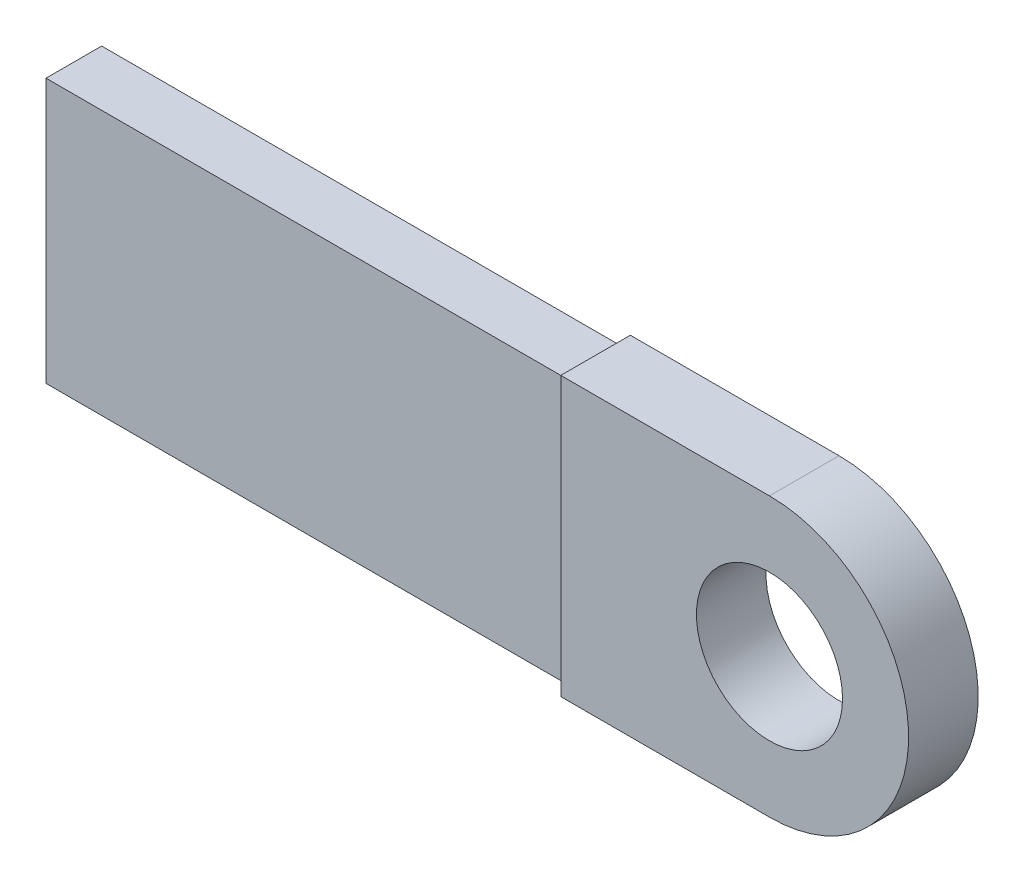
ISO-10303-21;
HEADER;
FILE_DESCRIPTION(('STEP AP214'),'2;1');
FILE_NAME('part.step','',(''),(''),'','','');
FILE_SCHEMA(('AUTOMOTIVE_DESIGN { 1 0 10303 214 1 1 1 1 }'));
ENDSEC;
DATA;
#1=APPLICATION_CONTEXT('core data for automotive mechanical design processes');
#2=APPLICATION_PROTOCOL_DEFINITION('international standard','automotive_design',2000,#1);
#3=PRODUCT_CONTEXT('',#1,'mechanical');
#4=PRODUCT('Part','Part','',(#3));
#5=PRODUCT_RELATED_PRODUCT_CATEGORY('part','',(#4));
#6=PRODUCT_DEFINITION_FORMATION('','',#4);
#7=PRODUCT_DEFINITION_CONTEXT('part definition',#1,'design');
#8=PRODUCT_DEFINITION('design','',#6,#7);
#9=PRODUCT_DEFINITION_SHAPE('','',#8);
#10=(LENGTH_UNIT() NAMED_UNIT(*) SI_UNIT(.MILLI.,.METRE.));
#11=(NAMED_UNIT(*) PLANE_ANGLE_UNIT() SI_UNIT($,.RADIAN.));
#12=(NAMED_UNIT(*) SI_UNIT($,.STERADIAN.) SOLID_ANGLE_UNIT());
#13=UNCERTAINTY_MEASURE_WITH_UNIT(LENGTH_MEASURE(1.E-05),#10,'distance_accuracy_value','');
#14=(GEOMETRIC_REPRESENTATION_CONTEXT(3) GLOBAL_UNCERTAINTY_ASSIGNED_CONTEXT((#13)) GLOBAL_UNIT_ASSIGNED_CONTEXT((#10,
#11,#12)) REPRESENTATION_CONTEXT('',''));
#15=CARTESIAN_POINT('',(0.,0.,0.));
#16=DIRECTION('',(0.,0.,1.));
#17=DIRECTION('',(1.,0.,0.));
#18=AXIS2_PLACEMENT_3D('',#15,#16,#17);
#19=CARTESIAN_POINT('',(0.,0.,19.9999999999999));
#20=DIRECTION('',(-1.,0.,0.));
#21=DIRECTION('',(0.,0.,0.999999999999999));
#22=AXIS2_PLACEMENT_3D('',#19,#20,#21);
#23=PLANE('',#22);
#24=DIRECTION('',(0.,1.,0.));
#25=VECTOR('',#24,1.);
#26=CARTESIAN_POINT('',(0.,0.,0.));
#27=LINE('',#26,#25);
#28=CARTESIAN_POINT('',(0.,0.,0.));
#29=VERTEX_POINT('',#28);
#30=CARTESIAN_POINT('',(0.,80.0000000000001,0.));
#31=VERTEX_POINT('',#30);
#32=EDGE_CURVE('E156',#29,#31,#27,.T.);
#33=ORIENTED_EDGE('',*,*,#32,.F.);
#34=DIRECTION('',(0.,0.,-0.999999999999999));
#35=VECTOR('',#34,1.);
#36=CARTESIAN_POINT('',(0.,0.,19.9999999999999));
#37=LINE('',#36,#35);
#38=CARTESIAN_POINT('',(0.,0.,19.9999999999999));
#39=VERTEX_POINT('',#38);
#40=EDGE_CURVE('E161',#39,#29,#37,.T.);
#41=ORIENTED_EDGE('',*,*,#40,.F.);
#42=DIRECTION('',(0.,1.,0.));
#43=VECTOR('',#42,1.);
#44=CARTESIAN_POINT('',(0.,0.,19.9999999999999));
#45=LINE('',#44,#43);
#46=CARTESIAN_POINT('',(0.,80.0000000000001,19.9999999999999));
#47=VERTEX_POINT('',#46);
#48=EDGE_CURVE('E147',#39,#47,#45,.T.);
#49=ORIENTED_EDGE('',*,*,#48,.T.);
#50=DIRECTION('',(0.,0.,-0.999999999999999));
#51=VECTOR('',#50,1.);
#52=CARTESIAN_POINT('',(0.,80.0000000000001,19.9999999999999));
#53=LINE('',#52,#51);
#54=EDGE_CURVE('E42',#47,#31,#53,.T.);
#55=ORIENTED_EDGE('',*,*,#54,.T.);
#56=EDGE_LOOP('',(#33,#41,#49,#55));
#57=FACE_BOUND('',#56,.T.);
#58=DIRECTION('',(0.,-1.,0.));
#59=VECTOR('',#58,1.);
#60=CARTESIAN_POINT('',(0.,78.0000000000001,2.));
#61=LINE('',#60,#59);
#62=CARTESIAN_POINT('',(0.,78.0000000000001,2.));
#63=VERTEX_POINT('',#62);
#64=CARTESIAN_POINT('',(0.,2.,2.));
#65=VERTEX_POINT('',#64);
#66=EDGE_CURVE('E282',#63,#65,#61,.T.);
#67=ORIENTED_EDGE('',*,*,#66,.F.);
#68=DIRECTION('',(0.,0.,-0.999999999999999));
#69=VECTOR('',#68,1.);
#70=CARTESIAN_POINT('',(0.,78.0000000000001,18.));
#71=LINE('',#70,#69);
#72=CARTESIAN_POINT('',(0.,78.0000000000001,18.));
#73=VERTEX_POINT('',#72);
#74=EDGE_CURVE('E128',#73,#63,#71,.T.);
#75=ORIENTED_EDGE('',*,*,#74,.F.);
#76=DIRECTION('',(0.,1.,0.));
#77=VECTOR('',#76,1.);
#78=CARTESIAN_POINT('',(0.,2.,18.));
#79=LINE('',#78,#77);
#80=CARTESIAN_POINT('',(0.,2.,18.));
#81=VERTEX_POINT('',#80);
#82=EDGE_CURVE('E124',#81,#73,#79,.T.);
#83=ORIENTED_EDGE('',*,*,#82,.F.);
#84=DIRECTION('',(0.,0.,0.999999999999999));
#85=VECTOR('',#84,1.);
#86=CARTESIAN_POINT('',(0.,2.,2.));
#87=LINE('',#86,#85);
#88=EDGE_CURVE('E279',#65,#81,#87,.T.);
#89=ORIENTED_EDGE('',*,*,#88,.F.);
#90=EDGE_LOOP('',(#67,#75,#83,#89));
#91=FACE_BOUND('',#90,.T.);
#92=ADVANCED_FACE('F34',(#57,#91),#23,.T.);
#93=CARTESIAN_POINT('',(60.0000000000001,40.,19.9999999999999));
#94=DIRECTION('',(0.,0.,-0.999999999999999));
#95=DIRECTION('',(-1.,0.,0.));
#96=AXIS2_PLACEMENT_3D('',#93,#94,#95);
#97=CYLINDRICAL_SURFACE('',#96,40.);
#98=CARTESIAN_POINT('',(60.0000000000001,40.,0.));
#99=DIRECTION('',(0.,0.,0.999999999999999));
#100=DIRECTION('',(1.,0.,0.));
#101=AXIS2_PLACEMENT_3D('',#98,#99,#100);
#102=CIRCLE('',#101,40.);
#103=CARTESIAN_POINT('',(60.0000000000001,80.0000000000001,0.));
#104=VERTEX_POINT('',#103);
#105=CARTESIAN_POINT('',(60.0000000000001,0.,0.));
#106=VERTEX_POINT('',#105);
#107=EDGE_CURVE('E139',#104,#106,#102,.F.);
#108=ORIENTED_EDGE('',*,*,#107,.F.);
#109=DIRECTION('',(0.,0.,-0.999999999999999));
#110=VECTOR('',#109,1.);
#111=CARTESIAN_POINT('',(60.0000000000001,80.0000000000001,19.9999999999999));
#112=LINE('',#111,#110);
#113=CARTESIAN_POINT('',(60.0000000000001,80.0000000000001,19.9999999999999));
#114=VERTEX_POINT('',#113);
#115=EDGE_CURVE('E11',#114,#104,#112,.T.);
#116=ORIENTED_EDGE('',*,*,#115,.F.);
#117=CARTESIAN_POINT('',(60.0000000000001,40.,19.9999999999999));
#118=DIRECTION('',(0.,0.,0.999999999999999));
#119=DIRECTION('',(1.,0.,0.));
#120=AXIS2_PLACEMENT_3D('',#117,#118,#119);
#121=CIRCLE('',#120,40.);
#122=CARTESIAN_POINT('',(60.0000000000001,0.,19.9999999999999));
#123=VERTEX_POINT('',#122);
#124=EDGE_CURVE('E141',#114,#123,#121,.F.);
#125=ORIENTED_EDGE('',*,*,#124,.T.);
#126=DIRECTION('',(0.,0.,-0.999999999999999));
#127=VECTOR('',#126,1.);
#128=CARTESIAN_POINT('',(60.0000000000001,0.,19.9999999999999));
#129=LINE('',#128,#127);
#130=EDGE_CURVE('E79',#123,#106,#129,.T.);
#131=ORIENTED_EDGE('',*,*,#130,.T.);
#132=EDGE_LOOP('',(#108,#116,#125,#131));
#133=FACE_BOUND('',#132,.T.);
#134=ADVANCED_FACE('F36',(#133),#97,.T.);
#135=CARTESIAN_POINT('',(0.,80.0000000000001,19.9999999999999));
#136=DIRECTION('',(0.,1.,0.));
#137=DIRECTION('',(0.,0.,0.999999999999999));
#138=AXIS2_PLACEMENT_3D('',#135,#136,#137);
#139=PLANE('',#138);
#140=DIRECTION('',(1.,0.,0.));
#141=VECTOR('',#140,1.);
#142=CARTESIAN_POINT('',(0.,80.0000000000001,0.));
#143=LINE('',#142,#141);
#144=EDGE_CURVE('E153',#31,#104,#143,.T.);
#145=ORIENTED_EDGE('',*,*,#144,.F.);
#146=ORIENTED_EDGE('',*,*,#54,.F.);
#147=DIRECTION('',(1.,0.,0.));
#148=VECTOR('',#147,1.);
#149=CARTESIAN_POINT('',(0.,80.0000000000001,19.9999999999999));
#150=LINE('',#149,#148);
#151=EDGE_CURVE('E143',#47,#114,#150,.T.);
#152=ORIENTED_EDGE('',*,*,#151,.T.);
#153=ORIENTED_EDGE('',*,*,#115,.T.);
#154=EDGE_LOOP('',(#145,#146,#152,#153));
#155=FACE_BOUND('',#154,.T.);
#156=ADVANCED_FACE('F168',(#155),#139,.T.);
#157=CARTESIAN_POINT('',(0.,0.,19.9999999999999));
#158=DIRECTION('',(0.,1.,0.));
#159=DIRECTION('',(0.,0.,0.999999999999999));
#160=AXIS2_PLACEMENT_3D('',#157,#158,#159);
#161=PLANE('',#160);
#162=DIRECTION('',(1.,0.,0.));
#163=VECTOR('',#162,1.);
#164=CARTESIAN_POINT('',(0.,0.,0.));
#165=LINE('',#164,#163);
#166=EDGE_CURVE('E144',#29,#106,#165,.T.);
#167=ORIENTED_EDGE('',*,*,#166,.T.);
#168=ORIENTED_EDGE('',*,*,#130,.F.);
#169=DIRECTION('',(1.,0.,0.));
#170=VECTOR('',#169,1.);
#171=CARTESIAN_POINT('',(0.,0.,19.9999999999999));
#172=LINE('',#171,#170);
#173=EDGE_CURVE('E58',#39,#123,#172,.T.);
#174=ORIENTED_EDGE('',*,*,#173,.F.);
#175=ORIENTED_EDGE('',*,*,#40,.T.);
#176=EDGE_LOOP('',(#167,#168,#174,#175));
#177=FACE_BOUND('',#176,.T.);
#178=ADVANCED_FACE('F173',(#177),#161,.F.);
#179=CARTESIAN_POINT('',(0.,0.,19.9999999999999));
#180=DIRECTION('',(0.,0.,0.999999999999999));
#181=DIRECTION('',(1.,0.,0.));
#182=AXIS2_PLACEMENT_3D('',#179,#180,#181);
#183=PLANE('',#182);
#184=CARTESIAN_POINT('',(60.0000000000001,40.,19.9999999999999));
#185=DIRECTION('',(0.,0.,0.999999999999999));
#186=DIRECTION('',(1.,0.,0.));
#187=AXIS2_PLACEMENT_3D('',#184,#185,#186);
#188=CIRCLE('',#187,21.);
#189=CARTESIAN_POINT('',(81.0000000000001,40.,19.9999999999999));
#190=VERTEX_POINT('',#189);
#191=EDGE_CURVE('E130',#190,#190,#188,.T.);
#192=ORIENTED_EDGE('',*,*,#191,.F.);
#193=EDGE_LOOP('',(#192));
#194=FACE_BOUND('',#193,.T.);
#195=ORIENTED_EDGE('',*,*,#124,.F.);
#196=ORIENTED_EDGE('',*,*,#151,.F.);
#197=ORIENTED_EDGE('',*,*,#48,.F.);
#198=ORIENTED_EDGE('',*,*,#173,.T.);
#199=EDGE_LOOP('',(#195,#196,#197,#198));
#200=FACE_BOUND('',#199,.T.);
#201=ADVANCED_FACE('F174',(#194,#200),#183,.T.);
#202=CARTESIAN_POINT('',(0.,0.,0.));
#203=DIRECTION('',(0.,0.,0.999999999999999));
#204=DIRECTION('',(1.,0.,0.));
#205=AXIS2_PLACEMENT_3D('',#202,#203,#204);
#206=PLANE('',#205);
#207=CARTESIAN_POINT('',(60.0000000000001,40.,0.));
#208=DIRECTION('',(0.,0.,0.999999999999999));
#209=DIRECTION('',(1.,0.,0.));
#210=AXIS2_PLACEMENT_3D('',#207,#208,#209);
#211=CIRCLE('',#210,21.);
#212=CARTESIAN_POINT('',(81.0000000000001,40.,0.));
#213=VERTEX_POINT('',#212);
#214=EDGE_CURVE('E133',#213,#213,#211,.T.);
#215=ORIENTED_EDGE('',*,*,#214,.T.);
#216=EDGE_LOOP('',(#215));
#217=FACE_BOUND('',#216,.T.);
#218=ORIENTED_EDGE('',*,*,#107,.T.);
#219=ORIENTED_EDGE('',*,*,#166,.F.);
#220=ORIENTED_EDGE('',*,*,#32,.T.);
#221=ORIENTED_EDGE('',*,*,#144,.T.);
#222=EDGE_LOOP('',(#218,#219,#220,#221));
#223=FACE_BOUND('',#222,.T.);
#224=ADVANCED_FACE('F171',(#217,#223),#206,.F.);
#225=CARTESIAN_POINT('',(60.0000000000001,40.,0.));
#226=DIRECTION('',(0.,0.,0.999999999999999));
#227=DIRECTION('',(1.,0.,0.));
#228=AXIS2_PLACEMENT_3D('',#225,#226,#227);
#229=CYLINDRICAL_SURFACE('',#228,21.);
#230=CARTESIAN_POINT('',(81.0000000000001,40.,0.));
#231=CARTESIAN_POINT('',(81.0000000000001,40.,0.208333333333333));
#232=CARTESIAN_POINT('',(81.0000000000001,40.,0.416666666666666));
#233=CARTESIAN_POINT('',(81.0000000000001,40.,0.833333333333331));
#234=CARTESIAN_POINT('',(81.0000000000001,40.,1.04166666666666));
#235=CARTESIAN_POINT('',(81.0000000000001,40.,1.45833333333333));
#236=CARTESIAN_POINT('',(81.0000000000001,40.,1.66666666666666));
#237=CARTESIAN_POINT('',(81.0000000000001,40.,2.08333333333333));
#238=CARTESIAN_POINT('',(81.0000000000001,40.,2.29166666666666));
#239=CARTESIAN_POINT('',(81.0000000000001,40.,2.70833333333333));
#240=CARTESIAN_POINT('',(81.0000000000001,40.,2.91666666666666));
#241=CARTESIAN_POINT('',(81.0000000000001,40.,3.33333333333333));
#242=CARTESIAN_POINT('',(81.0000000000001,40.,3.54166666666666));
#243=CARTESIAN_POINT('',(81.0000000000001,40.,3.95833333333332));
#244=CARTESIAN_POINT('',(81.0000000000001,40.,4.16666666666666));
#245=CARTESIAN_POINT('',(81.0000000000001,40.,4.58333333333332));
#246=CARTESIAN_POINT('',(81.0000000000001,40.,4.79166666666665));
#247=CARTESIAN_POINT('',(81.0000000000001,40.,5.20833333333332));
#248=CARTESIAN_POINT('',(81.0000000000001,40.,5.41666666666665));
#249=CARTESIAN_POINT('',(81.0000000000001,40.,5.83333333333332));
#250=CARTESIAN_POINT('',(81.0000000000001,40.,6.04166666666665));
#251=CARTESIAN_POINT('',(81.0000000000001,40.,6.45833333333332));
#252=CARTESIAN_POINT('',(81.0000000000001,40.,6.66666666666665));
#253=CARTESIAN_POINT('',(81.0000000000001,40.,7.08333333333332));
#254=CARTESIAN_POINT('',(81.0000000000001,40.,7.29166666666665));
#255=CARTESIAN_POINT('',(81.0000000000001,40.,7.70833333333331));
#256=CARTESIAN_POINT('',(81.0000000000001,40.,7.91666666666665));
#257=CARTESIAN_POINT('',(81.0000000000001,40.,8.33333333333331));
#258=CARTESIAN_POINT('',(81.0000000000001,40.,8.54166666666664));
#259=CARTESIAN_POINT('',(81.0000000000001,40.,8.95833333333331));
#260=CARTESIAN_POINT('',(81.0000000000001,40.,9.16666666666664));
#261=CARTESIAN_POINT('',(81.0000000000001,40.,9.58333333333331));
#262=CARTESIAN_POINT('',(81.0000000000001,40.,9.79166666666664));
#263=CARTESIAN_POINT('',(81.0000000000001,40.,10.2083333333333));
#264=CARTESIAN_POINT('',(81.0000000000001,40.,10.4166666666666));
#265=CARTESIAN_POINT('',(81.0000000000001,40.,10.8333333333333));
#266=CARTESIAN_POINT('',(81.0000000000001,40.,11.0416666666666));
#267=CARTESIAN_POINT('',(81.0000000000001,40.,11.4583333333333));
#268=CARTESIAN_POINT('',(81.0000000000001,40.,11.6666666666666));
#269=CARTESIAN_POINT('',(81.0000000000001,40.,12.0833333333333));
#270=CARTESIAN_POINT('',(81.0000000000001,40.,12.2916666666666));
#271=CARTESIAN_POINT('',(81.0000000000001,40.,12.7083333333333));
#272=CARTESIAN_POINT('',(81.0000000000001,40.,12.9166666666666));
#273=CARTESIAN_POINT('',(81.0000000000001,40.,13.3333333333333));
#274=CARTESIAN_POINT('',(81.0000000000001,40.,13.5416666666666));
#275=CARTESIAN_POINT('',(81.0000000000001,40.,13.9583333333333));
#276=CARTESIAN_POINT('',(81.0000000000001,40.,14.1666666666666));
#277=CARTESIAN_POINT('',(81.0000000000001,40.,14.5833333333333));
#278=CARTESIAN_POINT('',(81.0000000000001,40.,14.7916666666666));
#279=CARTESIAN_POINT('',(81.0000000000001,40.,15.2083333333333));
#280=CARTESIAN_POINT('',(81.0000000000001,40.,15.4166666666666));
#281=CARTESIAN_POINT('',(81.0000000000001,40.,15.8333333333333));
#282=CARTESIAN_POINT('',(81.0000000000001,40.,16.0416666666666));
#283=CARTESIAN_POINT('',(81.0000000000001,40.,16.4583333333333));
#284=CARTESIAN_POINT('',(81.0000000000001,40.,16.6666666666666));
#285=CARTESIAN_POINT('',(81.0000000000001,40.,17.0833333333333));
#286=CARTESIAN_POINT('',(81.0000000000001,40.,17.2916666666666));
#287=CARTESIAN_POINT('',(81.0000000000001,40.,17.7083333333333));
#288=CARTESIAN_POINT('',(81.0000000000001,40.,17.9166666666666));
#289=CARTESIAN_POINT('',(81.0000000000001,40.,18.3333333333333));
#290=CARTESIAN_POINT('',(81.0000000000001,40.,18.5416666666666));
#291=CARTESIAN_POINT('',(81.0000000000001,40.,18.9583333333333));
#292=CARTESIAN_POINT('',(81.0000000000001,40.,19.1666666666666));
#293=CARTESIAN_POINT('',(81.0000000000001,40.,19.5833333333333));
#294=CARTESIAN_POINT('',(81.0000000000001,40.,19.7916666666666));
#295=CARTESIAN_POINT('',(81.0000000000001,40.,19.9999999999999));
#296=B_SPLINE_CURVE_WITH_KNOTS('',3,(#230,#231,#232,#233,#234,#235,#236,#237,#238,#239,#240,
#241,#242,#243,#244,#245,#246,#247,#248,#249,#250,#251,#252,#253,#254,#255,#256,#257,#258,#259,
#260,#261,#262,#263,#264,#265,#266,#267,#268,#269,#270,#271,#272,#273,#274,#275,#276,#277,#278,
#279,#280,#281,#282,#283,#284,#285,#286,#287,#288,#289,#290,#291,#292,#293,#294,#295),
.UNSPECIFIED.,.F.,.F.,(4,2,2,2,2,2,2,2,2,2,2,2,2,2,2,2,2,2,2,2,2,2,2,2,2,2,2,2,2,2,2,2,4),(0.,
0.624999999999998,1.25,1.875,2.49999999999999,3.12499999999999,3.74999999999999,
4.37499999999999,4.99999999999999,5.62499999999999,6.24999999999998,6.87499999999998,
7.49999999999998,8.12499999999998,8.74999999999998,9.37499999999998,9.99999999999997,10.625,
11.25,11.875,12.5,13.125,13.75,14.375,15.,15.625,16.25,16.875,17.5,18.125,18.75,
19.3749999999999,19.9999999999999),.UNSPECIFIED.);
#297=EDGE_CURVE('BSEAM188',#213,#190,#296,.T.);
#298=ORIENTED_EDGE('',*,*,#214,.F.);
#299=ORIENTED_EDGE('',*,*,#191,.T.);
#300=ORIENTED_EDGE('',*,*,#297,.T.);
#301=ORIENTED_EDGE('',*,*,#297,.F.);
#302=EDGE_LOOP('',(#298,#300,#299,#301));
#303=FACE_BOUND('',#302,.T.);
#304=ADVANCED_FACE('F188',(#303),#229,.F.);
#305=CARTESIAN_POINT('',(-150.,78.,18.));
#306=DIRECTION('',(0.,-1.,0.));
#307=DIRECTION('',(0.,0.,-0.999999999999999));
#308=AXIS2_PLACEMENT_3D('',#305,#306,#307);
#309=PLANE('',#308);
#310=ORIENTED_EDGE('',*,*,#74,.T.);
#311=DIRECTION('',(1.,0.,0.));
#312=VECTOR('',#311,1.);
#313=CARTESIAN_POINT('',(-150.,78.,2.));
#314=LINE('',#313,#312);
#315=CARTESIAN_POINT('',(-150.,78.,2.));
#316=VERTEX_POINT('',#315);
#317=EDGE_CURVE('E109',#316,#63,#314,.T.);
#318=ORIENTED_EDGE('',*,*,#317,.F.);
#319=DIRECTION('',(0.,0.,-0.999999999999999));
#320=VECTOR('',#319,1.);
#321=CARTESIAN_POINT('',(-150.,78.,18.));
#322=LINE('',#321,#320);
#323=CARTESIAN_POINT('',(-150.,78.,18.));
#324=VERTEX_POINT('',#323);
#325=EDGE_CURVE('E116',#324,#316,#322,.T.);
#326=ORIENTED_EDGE('',*,*,#325,.F.);
#327=DIRECTION('',(1.,0.,0.));
#328=VECTOR('',#327,1.);
#329=CARTESIAN_POINT('',(-150.,78.,18.));
#330=LINE('',#329,#328);
#331=EDGE_CURVE('E277',#324,#73,#330,.T.);
#332=ORIENTED_EDGE('',*,*,#331,.T.);
#333=EDGE_LOOP('',(#310,#318,#326,#332));
#334=FACE_BOUND('',#333,.T.);
#335=ADVANCED_FACE('F126',(#334),#309,.F.);
#336=CARTESIAN_POINT('',(-150.,78.,2.));
#337=DIRECTION('',(0.,0.,0.999999999999999));
#338=DIRECTION('',(1.,0.,0.));
#339=AXIS2_PLACEMENT_3D('',#336,#337,#338);
#340=PLANE('',#339);
#341=ORIENTED_EDGE('',*,*,#66,.T.);
#342=DIRECTION('',(1.,0.,0.));
#343=VECTOR('',#342,1.);
#344=CARTESIAN_POINT('',(-150.,2.,2.));
#345=LINE('',#344,#343);
#346=CARTESIAN_POINT('',(-150.,2.,2.));
#347=VERTEX_POINT('',#346);
#348=EDGE_CURVE('E112',#347,#65,#345,.T.);
#349=ORIENTED_EDGE('',*,*,#348,.F.);
#350=DIRECTION('',(0.,-1.,0.));
#351=VECTOR('',#350,1.);
#352=CARTESIAN_POINT('',(-150.,78.,2.));
#353=LINE('',#352,#351);
#354=EDGE_CURVE('E105',#316,#347,#353,.T.);
#355=ORIENTED_EDGE('',*,*,#354,.F.);
#356=ORIENTED_EDGE('',*,*,#317,.T.);
#357=EDGE_LOOP('',(#341,#349,#355,#356));
#358=FACE_BOUND('',#357,.T.);
#359=ADVANCED_FACE('F107',(#358),#340,.F.);
#360=CARTESIAN_POINT('',(-150.,2.,2.));
#361=DIRECTION('',(0.,1.,0.));
#362=DIRECTION('',(0.,0.,0.999999999999999));
#363=AXIS2_PLACEMENT_3D('',#360,#361,#362);
#364=PLANE('',#363);
#365=ORIENTED_EDGE('',*,*,#88,.T.);
#366=DIRECTION('',(1.,0.,0.));
#367=VECTOR('',#366,1.);
#368=CARTESIAN_POINT('',(-150.,2.,18.));
#369=LINE('',#368,#367);
#370=CARTESIAN_POINT('',(-150.,2.,18.));
#371=VERTEX_POINT('',#370);
#372=EDGE_CURVE('E49',#371,#81,#369,.T.);
#373=ORIENTED_EDGE('',*,*,#372,.F.);
#374=DIRECTION('',(0.,0.,0.999999999999999));
#375=VECTOR('',#374,1.);
#376=CARTESIAN_POINT('',(-150.,2.,2.));
#377=LINE('',#376,#375);
#378=EDGE_CURVE('E115',#347,#371,#377,.T.);
#379=ORIENTED_EDGE('',*,*,#378,.F.);
#380=ORIENTED_EDGE('',*,*,#348,.T.);
#381=EDGE_LOOP('',(#365,#373,#379,#380));
#382=FACE_BOUND('',#381,.T.);
#383=ADVANCED_FACE('F200',(#382),#364,.F.);
#384=CARTESIAN_POINT('',(-150.,2.,18.));
#385=DIRECTION('',(0.,0.,-0.999999999999999));
#386=DIRECTION('',(-1.,0.,0.));
#387=AXIS2_PLACEMENT_3D('',#384,#385,#386);
#388=PLANE('',#387);
#389=ORIENTED_EDGE('',*,*,#82,.T.);
#390=ORIENTED_EDGE('',*,*,#331,.F.);
#391=DIRECTION('',(0.,1.,0.));
#392=VECTOR('',#391,1.);
#393=CARTESIAN_POINT('',(-150.,2.,18.));
#394=LINE('',#393,#392);
#395=EDGE_CURVE('E120',#371,#324,#394,.T.);
#396=ORIENTED_EDGE('',*,*,#395,.F.);
#397=ORIENTED_EDGE('',*,*,#372,.T.);
#398=EDGE_LOOP('',(#389,#390,#396,#397));
#399=FACE_BOUND('',#398,.T.);
#400=ADVANCED_FACE('F203',(#399),#388,.F.);
#401=CARTESIAN_POINT('',(-150.,0.,0.));
#402=DIRECTION('',(-1.,0.,0.));
#403=DIRECTION('',(0.,0.,0.999999999999999));
#404=AXIS2_PLACEMENT_3D('',#401,#402,#403);
#405=PLANE('',#404);
#406=ORIENTED_EDGE('',*,*,#325,.T.);
#407=ORIENTED_EDGE('',*,*,#354,.T.);
#408=ORIENTED_EDGE('',*,*,#378,.T.);
#409=ORIENTED_EDGE('',*,*,#395,.T.);
#410=EDGE_LOOP('',(#406,#407,#408,#409));
#411=FACE_BOUND('',#410,.T.);
#412=ADVANCED_FACE('F119',(#411),#405,.T.);
#413=CLOSED_SHELL('',(#92,#134,#156,#178,#201,#224,#304,#335,#359,#383,#400,#412));
#414=MANIFOLD_SOLID_BREP('B2',#413);
#415=ADVANCED_BREP_SHAPE_REPRESENTATION('',(#18,#414),#14);
#416=SHAPE_DEFINITION_REPRESENTATION(#9,#415);
ENDSEC;
END-ISO-10303-21;
